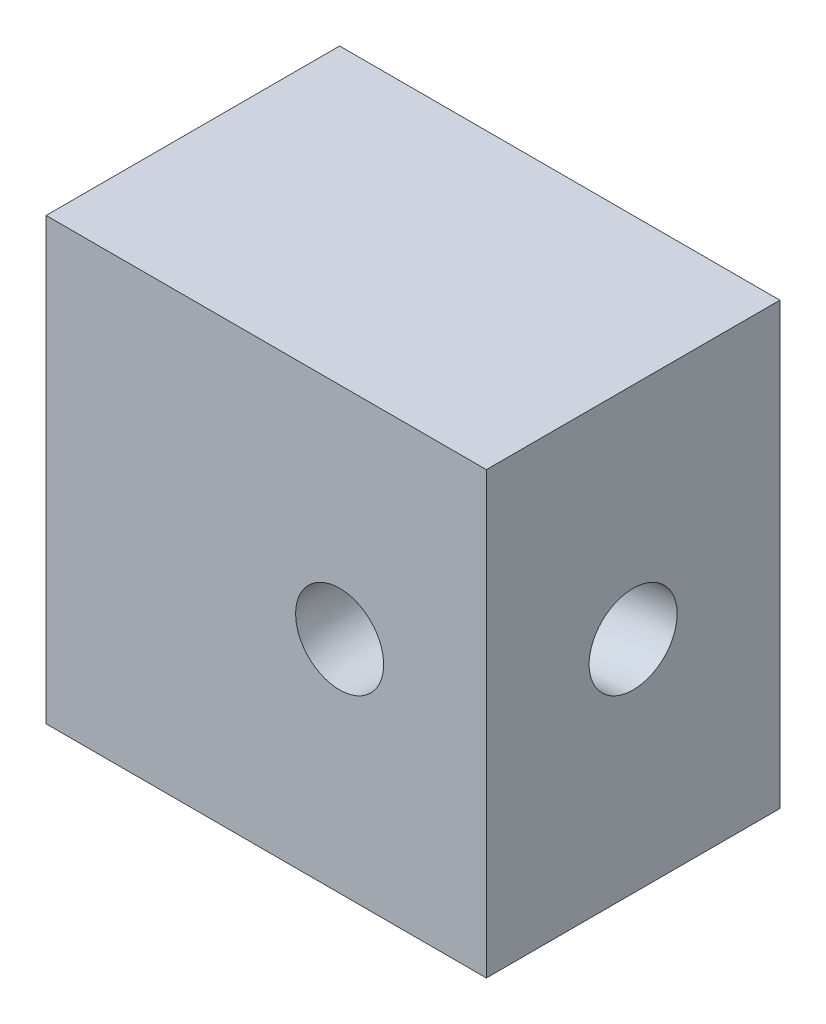
ISO-10303-21;
HEADER;
FILE_DESCRIPTION(('STEP AP214'),'2;1');
FILE_NAME('part.step','',(''),(''),'','','');
FILE_SCHEMA(('AUTOMOTIVE_DESIGN { 1 0 10303 214 1 1 1 1 }'));
ENDSEC;
DATA;
#1=APPLICATION_CONTEXT('core data for automotive mechanical design processes');
#2=APPLICATION_PROTOCOL_DEFINITION('international standard','automotive_design',2000,#1);
#3=PRODUCT_CONTEXT('',#1,'mechanical');
#4=PRODUCT('Part','Part','',(#3));
#5=PRODUCT_RELATED_PRODUCT_CATEGORY('part','',(#4));
#6=PRODUCT_DEFINITION_FORMATION('','',#4);
#7=PRODUCT_DEFINITION_CONTEXT('part definition',#1,'design');
#8=PRODUCT_DEFINITION('design','',#6,#7);
#9=PRODUCT_DEFINITION_SHAPE('','',#8);
#10=(LENGTH_UNIT() NAMED_UNIT(*) SI_UNIT(.MILLI.,.METRE.));
#11=(NAMED_UNIT(*) PLANE_ANGLE_UNIT() SI_UNIT($,.RADIAN.));
#12=(NAMED_UNIT(*) SI_UNIT($,.STERADIAN.) SOLID_ANGLE_UNIT());
#13=UNCERTAINTY_MEASURE_WITH_UNIT(LENGTH_MEASURE(1.E-05),#10,'distance_accuracy_value','');
#14=(GEOMETRIC_REPRESENTATION_CONTEXT(3) GLOBAL_UNCERTAINTY_ASSIGNED_CONTEXT((#13)) GLOBAL_UNIT_ASSIGNED_CONTEXT((#10,
#11,#12)) REPRESENTATION_CONTEXT('',''));
#15=CARTESIAN_POINT('',(0.,0.,0.));
#16=DIRECTION('',(0.,0.,1.));
#17=DIRECTION('',(1.,0.,0.));
#18=AXIS2_PLACEMENT_3D('',#15,#16,#17);
#19=CARTESIAN_POINT('',(38.1,38.1,50.8));
#20=DIRECTION('',(-1.,0.,0.));
#21=DIRECTION('',(0.,0.,1.));
#22=AXIS2_PLACEMENT_3D('',#19,#20,#21);
#23=PLANE('',#22);
#24=CARTESIAN_POINT('',(38.1,0.,25.4));
#25=DIRECTION('',(-1.,0.,0.));
#26=DIRECTION('',(0.,0.,1.));
#27=AXIS2_PLACEMENT_3D('',#24,#25,#26);
#28=CIRCLE('',#27,7.62);
#29=CARTESIAN_POINT('',(38.1,0.,17.78));
#30=VERTEX_POINT('',#29);
#31=EDGE_CURVE('E107',#30,#30,#28,.F.);
#32=ORIENTED_EDGE('',*,*,#31,.F.);
#33=EDGE_LOOP('',(#32));
#34=FACE_BOUND('',#33,.T.);
#35=DIRECTION('',(0.,1.,0.));
#36=VECTOR('',#35,1.);
#37=CARTESIAN_POINT('',(38.1,38.1,0.));
#38=LINE('',#37,#36);
#39=CARTESIAN_POINT('',(38.1,-38.1,0.));
#40=VERTEX_POINT('',#39);
#41=CARTESIAN_POINT('',(38.1,38.1,0.));
#42=VERTEX_POINT('',#41);
#43=EDGE_CURVE('E104',#40,#42,#38,.T.);
#44=ORIENTED_EDGE('',*,*,#43,.T.);
#45=DIRECTION('',(0.,0.,-1.));
#46=VECTOR('',#45,1.);
#47=CARTESIAN_POINT('',(38.1,38.1,50.8));
#48=LINE('',#47,#46);
#49=CARTESIAN_POINT('',(38.1,38.1,50.8));
#50=VERTEX_POINT('',#49);
#51=EDGE_CURVE('E11',#50,#42,#48,.T.);
#52=ORIENTED_EDGE('',*,*,#51,.F.);
#53=DIRECTION('',(0.,1.,0.));
#54=VECTOR('',#53,1.);
#55=CARTESIAN_POINT('',(38.1,38.1,50.8));
#56=LINE('',#55,#54);
#57=CARTESIAN_POINT('',(38.1,-38.1,50.8));
#58=VERTEX_POINT('',#57);
#59=EDGE_CURVE('E91',#58,#50,#56,.T.);
#60=ORIENTED_EDGE('',*,*,#59,.F.);
#61=DIRECTION('',(0.,0.,-1.));
#62=VECTOR('',#61,1.);
#63=CARTESIAN_POINT('',(38.1,-38.1,50.8));
#64=LINE('',#63,#62);
#65=EDGE_CURVE('E100',#58,#40,#64,.T.);
#66=ORIENTED_EDGE('',*,*,#65,.T.);
#67=EDGE_LOOP('',(#44,#52,#60,#66));
#68=FACE_BOUND('',#67,.T.);
#69=ADVANCED_FACE('F39',(#34,#68),#23,.F.);
#70=CARTESIAN_POINT('',(-38.1,38.1,50.8));
#71=DIRECTION('',(0.,-1.,0.));
#72=DIRECTION('',(0.,0.,-1.));
#73=AXIS2_PLACEMENT_3D('',#70,#71,#72);
#74=PLANE('',#73);
#75=DIRECTION('',(-1.,0.,0.));
#76=VECTOR('',#75,1.);
#77=CARTESIAN_POINT('',(-38.1,38.1,0.));
#78=LINE('',#77,#76);
#79=CARTESIAN_POINT('',(-38.1,38.1,0.));
#80=VERTEX_POINT('',#79);
#81=EDGE_CURVE('E95',#42,#80,#78,.T.);
#82=ORIENTED_EDGE('',*,*,#81,.T.);
#83=DIRECTION('',(0.,0.,-1.));
#84=VECTOR('',#83,1.);
#85=CARTESIAN_POINT('',(-38.1,38.1,50.8));
#86=LINE('',#85,#84);
#87=CARTESIAN_POINT('',(-38.1,38.1,50.8));
#88=VERTEX_POINT('',#87);
#89=EDGE_CURVE('E48',#88,#80,#86,.T.);
#90=ORIENTED_EDGE('',*,*,#89,.F.);
#91=DIRECTION('',(-1.,0.,0.));
#92=VECTOR('',#91,1.);
#93=CARTESIAN_POINT('',(-38.1,38.1,50.8));
#94=LINE('',#93,#92);
#95=EDGE_CURVE('E86',#50,#88,#94,.T.);
#96=ORIENTED_EDGE('',*,*,#95,.F.);
#97=ORIENTED_EDGE('',*,*,#51,.T.);
#98=EDGE_LOOP('',(#82,#90,#96,#97));
#99=FACE_BOUND('',#98,.T.);
#100=ADVANCED_FACE('F94',(#99),#74,.F.);
#101=CARTESIAN_POINT('',(-38.1,38.1,50.8));
#102=DIRECTION('',(1.,0.,0.));
#103=DIRECTION('',(0.,0.,-1.));
#104=AXIS2_PLACEMENT_3D('',#101,#102,#103);
#105=PLANE('',#104);
#106=DIRECTION('',(0.,-1.,0.));
#107=VECTOR('',#106,1.);
#108=CARTESIAN_POINT('',(-38.1,38.1,0.));
#109=LINE('',#108,#107);
#110=CARTESIAN_POINT('',(-38.1,-38.1,0.));
#111=VERTEX_POINT('',#110);
#112=EDGE_CURVE('E73',#80,#111,#109,.T.);
#113=ORIENTED_EDGE('',*,*,#112,.T.);
#114=DIRECTION('',(0.,0.,-1.));
#115=VECTOR('',#114,1.);
#116=CARTESIAN_POINT('',(-38.1,-38.1,50.8));
#117=LINE('',#116,#115);
#118=CARTESIAN_POINT('',(-38.1,-38.1,50.8));
#119=VERTEX_POINT('',#118);
#120=EDGE_CURVE('E96',#119,#111,#117,.T.);
#121=ORIENTED_EDGE('',*,*,#120,.F.);
#122=DIRECTION('',(0.,-1.,0.));
#123=VECTOR('',#122,1.);
#124=CARTESIAN_POINT('',(-38.1,38.1,50.8));
#125=LINE('',#124,#123);
#126=EDGE_CURVE('E89',#88,#119,#125,.T.);
#127=ORIENTED_EDGE('',*,*,#126,.F.);
#128=ORIENTED_EDGE('',*,*,#89,.T.);
#129=EDGE_LOOP('',(#113,#121,#127,#128));
#130=FACE_BOUND('',#129,.T.);
#131=ADVANCED_FACE('F98',(#130),#105,.F.);
#132=CARTESIAN_POINT('',(-38.1,-38.1,50.8));
#133=DIRECTION('',(0.,1.,0.));
#134=DIRECTION('',(0.,0.,1.));
#135=AXIS2_PLACEMENT_3D('',#132,#133,#134);
#136=PLANE('',#135);
#137=DIRECTION('',(1.,0.,0.));
#138=VECTOR('',#137,1.);
#139=CARTESIAN_POINT('',(-38.1,-38.1,0.));
#140=LINE('',#139,#138);
#141=EDGE_CURVE('E79',#111,#40,#140,.T.);
#142=ORIENTED_EDGE('',*,*,#141,.T.);
#143=ORIENTED_EDGE('',*,*,#65,.F.);
#144=DIRECTION('',(1.,0.,0.));
#145=VECTOR('',#144,1.);
#146=CARTESIAN_POINT('',(-38.1,-38.1,50.8));
#147=LINE('',#146,#145);
#148=EDGE_CURVE('E56',#119,#58,#147,.T.);
#149=ORIENTED_EDGE('',*,*,#148,.F.);
#150=ORIENTED_EDGE('',*,*,#120,.T.);
#151=EDGE_LOOP('',(#142,#143,#149,#150));
#152=FACE_BOUND('',#151,.T.);
#153=ADVANCED_FACE('F112',(#152),#136,.F.);
#154=CARTESIAN_POINT('',(0.,0.,50.8));
#155=DIRECTION('',(0.,0.,1.));
#156=DIRECTION('',(1.,0.,0.));
#157=AXIS2_PLACEMENT_3D('',#154,#155,#156);
#158=PLANE('',#157);
#159=CARTESIAN_POINT('',(12.7,0.,50.8));
#160=DIRECTION('',(0.,0.,1.));
#161=DIRECTION('',(1.,0.,0.));
#162=AXIS2_PLACEMENT_3D('',#159,#160,#161);
#163=CIRCLE('',#162,7.62);
#164=CARTESIAN_POINT('',(5.07999999999999,0.,50.8));
#165=VERTEX_POINT('',#164);
#166=EDGE_CURVE('E42',#165,#165,#163,.F.);
#167=ORIENTED_EDGE('',*,*,#166,.T.);
#168=EDGE_LOOP('',(#167));
#169=FACE_BOUND('',#168,.T.);
#170=ORIENTED_EDGE('',*,*,#59,.T.);
#171=ORIENTED_EDGE('',*,*,#95,.T.);
#172=ORIENTED_EDGE('',*,*,#126,.T.);
#173=ORIENTED_EDGE('',*,*,#148,.T.);
#174=EDGE_LOOP('',(#170,#171,#172,#173));
#175=FACE_BOUND('',#174,.T.);
#176=ADVANCED_FACE('F87',(#169,#175),#158,.T.);
#177=CARTESIAN_POINT('',(0.,0.,0.));
#178=DIRECTION('',(0.,0.,1.));
#179=DIRECTION('',(1.,0.,0.));
#180=AXIS2_PLACEMENT_3D('',#177,#178,#179);
#181=PLANE('',#180);
#182=ORIENTED_EDGE('',*,*,#43,.F.);
#183=ORIENTED_EDGE('',*,*,#141,.F.);
#184=ORIENTED_EDGE('',*,*,#112,.F.);
#185=ORIENTED_EDGE('',*,*,#81,.F.);
#186=EDGE_LOOP('',(#182,#183,#184,#185));
#187=FACE_BOUND('',#186,.T.);
#188=ADVANCED_FACE('F115',(#187),#181,.F.);
#189=CARTESIAN_POINT('',(38.1,0.,50.8));
#190=DIRECTION('',(0.,-1.,0.));
#191=DIRECTION('',(0.,0.,-1.));
#192=AXIS2_PLACEMENT_3D('',#189,#190,#191);
#193=TOROIDAL_SURFACE('',#192,25.4,7.62);
#194=CARTESIAN_POINT('',(38.1,0.,50.8));
#195=DIRECTION('',(0.,-1.,0.));
#196=DIRECTION('',(0.,0.,-1.));
#197=AXIS2_PLACEMENT_3D('',#194,#195,#196);
#198=CIRCLE('',#197,33.02);
#199=EDGE_CURVE('',#165,#30,#198,.T.);
#200=ORIENTED_EDGE('',*,*,#166,.F.);
#201=ORIENTED_EDGE('',*,*,#31,.T.);
#202=ORIENTED_EDGE('',*,*,#199,.T.);
#203=ORIENTED_EDGE('',*,*,#199,.F.);
#204=EDGE_LOOP('',(#200,#202,#201,#203));
#205=FACE_BOUND('',#204,.T.);
#206=ADVANCED_FACE('F125',(#205),#193,.F.);
#207=CLOSED_SHELL('',(#69,#100,#131,#153,#176,#188,#206));
#208=MANIFOLD_SOLID_BREP('B2',#207);
#209=ADVANCED_BREP_SHAPE_REPRESENTATION('',(#18,#208),#14);
#210=SHAPE_DEFINITION_REPRESENTATION(#9,#209);
ENDSEC;
END-ISO-10303-21;
